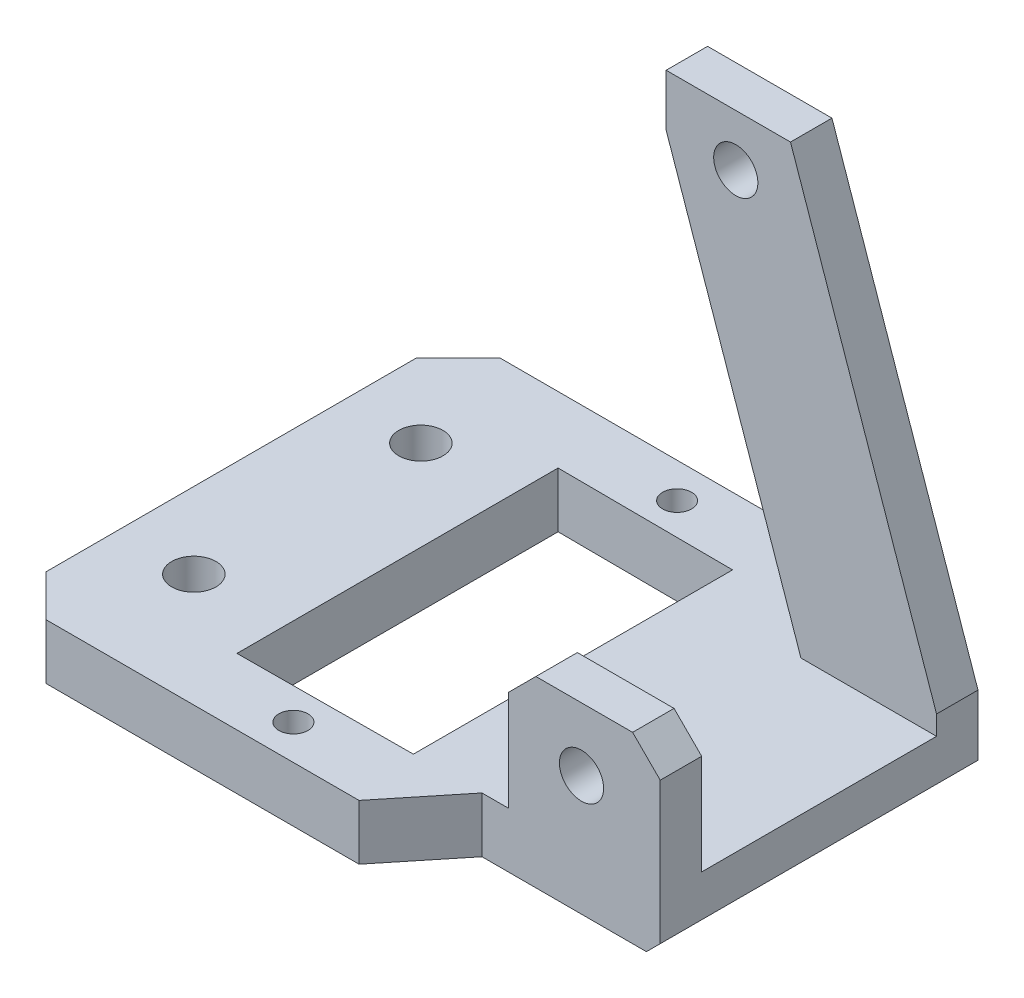
ISO-10303-21;
HEADER;
FILE_DESCRIPTION(('STEP AP214'),'2;1');
FILE_NAME('part.step','',(''),(''),'','','');
FILE_SCHEMA(('AUTOMOTIVE_DESIGN { 1 0 10303 214 1 1 1 1 }'));
ENDSEC;
DATA;
#1=APPLICATION_CONTEXT('core data for automotive mechanical design processes');
#2=APPLICATION_PROTOCOL_DEFINITION('international standard','automotive_design',2000,#1);
#3=PRODUCT_CONTEXT('',#1,'mechanical');
#4=PRODUCT('Part','Part','',(#3));
#5=PRODUCT_RELATED_PRODUCT_CATEGORY('part','',(#4));
#6=PRODUCT_DEFINITION_FORMATION('','',#4);
#7=PRODUCT_DEFINITION_CONTEXT('part definition',#1,'design');
#8=PRODUCT_DEFINITION('design','',#6,#7);
#9=PRODUCT_DEFINITION_SHAPE('','',#8);
#10=(LENGTH_UNIT() NAMED_UNIT(*) SI_UNIT(.MILLI.,.METRE.));
#11=(NAMED_UNIT(*) PLANE_ANGLE_UNIT() SI_UNIT($,.RADIAN.));
#12=(NAMED_UNIT(*) SI_UNIT($,.STERADIAN.) SOLID_ANGLE_UNIT());
#13=UNCERTAINTY_MEASURE_WITH_UNIT(LENGTH_MEASURE(1.E-05),#10,'distance_accuracy_value','');
#14=(GEOMETRIC_REPRESENTATION_CONTEXT(3) GLOBAL_UNCERTAINTY_ASSIGNED_CONTEXT((#13)) GLOBAL_UNIT_ASSIGNED_CONTEXT((#10,
#11,#12)) REPRESENTATION_CONTEXT('',''));
#15=CARTESIAN_POINT('',(0.,0.,0.));
#16=DIRECTION('',(0.,0.,1.));
#17=DIRECTION('',(1.,0.,0.));
#18=AXIS2_PLACEMENT_3D('',#15,#16,#17);
#19=CARTESIAN_POINT('',(17.5,4.,0.));
#20=DIRECTION('',(-1.,0.,0.));
#21=DIRECTION('',(0.,0.,1.));
#22=AXIS2_PLACEMENT_3D('',#19,#20,#21);
#23=PLANE('',#22);
#24=DIRECTION('',(0.,1.,0.));
#25=VECTOR('',#24,1.);
#26=CARTESIAN_POINT('',(17.5,2.25079433715874,8.5));
#27=LINE('',#26,#25);
#28=CARTESIAN_POINT('',(17.5,4.,8.5));
#29=VERTEX_POINT('',#28);
#30=CARTESIAN_POINT('',(17.5,11.2507943371587,8.5));
#31=VERTEX_POINT('',#30);
#32=EDGE_CURVE('E338',#29,#31,#27,.T.);
#33=ORIENTED_EDGE('',*,*,#32,.T.);
#34=DIRECTION('',(0.,0.,1.));
#35=VECTOR('',#34,1.);
#36=CARTESIAN_POINT('',(17.5,11.2507943371587,11.5));
#37=LINE('',#36,#35);
#38=CARTESIAN_POINT('',(17.5,11.2507943371587,11.5));
#39=VERTEX_POINT('',#38);
#40=EDGE_CURVE('E407',#31,#39,#37,.T.);
#41=ORIENTED_EDGE('',*,*,#40,.T.);
#42=DIRECTION('',(0.,-1.,0.));
#43=VECTOR('',#42,1.);
#44=CARTESIAN_POINT('',(17.5,4.,11.5));
#45=LINE('',#44,#43);
#46=CARTESIAN_POINT('',(17.5,0.999999999999994,11.5));
#47=VERTEX_POINT('',#46);
#48=EDGE_CURVE('E359',#39,#47,#45,.T.);
#49=ORIENTED_EDGE('',*,*,#48,.T.);
#50=DIRECTION('',(0.,0.,-1.));
#51=VECTOR('',#50,1.);
#52=CARTESIAN_POINT('',(17.5,0.999999999999994,0.));
#53=LINE('',#52,#51);
#54=CARTESIAN_POINT('',(17.5,0.999999999999994,-11.5));
#55=VERTEX_POINT('',#54);
#56=EDGE_CURVE('E375',#47,#55,#53,.T.);
#57=ORIENTED_EDGE('',*,*,#56,.T.);
#58=DIRECTION('',(0.,-1.,0.));
#59=VECTOR('',#58,1.);
#60=CARTESIAN_POINT('',(17.5,4.,-11.5));
#61=LINE('',#60,#59);
#62=CARTESIAN_POINT('',(17.5,5.39908922103168,-11.5));
#63=VERTEX_POINT('',#62);
#64=EDGE_CURVE('E364',#63,#55,#61,.T.);
#65=ORIENTED_EDGE('',*,*,#64,.F.);
#66=DIRECTION('',(0.,0.,-1.));
#67=VECTOR('',#66,1.);
#68=CARTESIAN_POINT('',(17.5,5.39908922103168,-8.5));
#69=LINE('',#68,#67);
#70=CARTESIAN_POINT('',(17.5,5.39908922103168,-8.5));
#71=VERTEX_POINT('',#70);
#72=EDGE_CURVE('E326',#71,#63,#69,.T.);
#73=ORIENTED_EDGE('',*,*,#72,.F.);
#74=DIRECTION('',(0.,-1.,0.));
#75=VECTOR('',#74,1.);
#76=CARTESIAN_POINT('',(17.5,2.4942576008242,-8.5));
#77=LINE('',#76,#75);
#78=CARTESIAN_POINT('',(17.5,4.,-8.5));
#79=VERTEX_POINT('',#78);
#80=EDGE_CURVE('E311',#71,#79,#77,.T.);
#81=ORIENTED_EDGE('',*,*,#80,.T.);
#82=DIRECTION('',(0.,0.,-1.));
#83=VECTOR('',#82,1.);
#84=CARTESIAN_POINT('',(17.5,4.,0.));
#85=LINE('',#84,#83);
#86=EDGE_CURVE('E350',#29,#79,#85,.T.);
#87=ORIENTED_EDGE('',*,*,#86,.F.);
#88=EDGE_LOOP('',(#33,#41,#49,#57,#65,#73,#81,#87));
#89=FACE_BOUND('',#88,.T.);
#90=ADVANCED_FACE('F36',(#89),#23,.F.);
#91=CARTESIAN_POINT('',(-17.5,4.,-11.5));
#92=DIRECTION('',(0.,0.,1.));
#93=DIRECTION('',(1.,0.,0.));
#94=AXIS2_PLACEMENT_3D('',#91,#92,#93);
#95=PLANE('',#94);
#96=CARTESIAN_POINT('',(2.96715212901444,32.2271214046752,-11.5));
#97=DIRECTION('',(0.,0.,-1.));
#98=DIRECTION('',(-1.,0.,0.));
#99=AXIS2_PLACEMENT_3D('',#96,#97,#98);
#100=CIRCLE('',#99,1.6);
#101=CARTESIAN_POINT('',(1.36715212901444,32.2271214046752,-11.5));
#102=VERTEX_POINT('',#101);
#103=EDGE_CURVE('E283',#102,#102,#100,.T.);
#104=ORIENTED_EDGE('',*,*,#103,.F.);
#105=EDGE_LOOP('',(#104));
#106=FACE_BOUND('',#105,.T.);
#107=ORIENTED_EDGE('',*,*,#64,.T.);
#108=DIRECTION('',(0.70710678118655,0.707106781186545,0.));
#109=VECTOR('',#108,1.);
#110=CARTESIAN_POINT('',(17.5,0.999999999999994,-11.5));
#111=LINE('',#110,#109);
#112=CARTESIAN_POINT('',(16.5,0.,-11.5));
#113=VERTEX_POINT('',#112);
#114=EDGE_CURVE('E382',#55,#113,#111,.F.);
#115=ORIENTED_EDGE('',*,*,#114,.T.);
#116=DIRECTION('',(-1.,0.,0.));
#117=VECTOR('',#116,1.);
#118=CARTESIAN_POINT('',(-17.5,0.,-11.5));
#119=LINE('',#118,#117);
#120=CARTESIAN_POINT('',(4.5983698282398,0.,-11.5));
#121=VERTEX_POINT('',#120);
#122=EDGE_CURVE('E346',#113,#121,#119,.T.);
#123=ORIENTED_EDGE('',*,*,#122,.T.);
#124=DIRECTION('',(0.,-1.,0.));
#125=VECTOR('',#124,1.);
#126=CARTESIAN_POINT('',(4.5983698282398,4.,-11.5));
#127=LINE('',#126,#125);
#128=CARTESIAN_POINT('',(4.5983698282398,4.,-11.5));
#129=VERTEX_POINT('',#128);
#130=EDGE_CURVE('E280',#129,#121,#127,.T.);
#131=ORIENTED_EDGE('',*,*,#130,.F.);
#132=DIRECTION('',(-1.,0.,0.));
#133=VECTOR('',#132,1.);
#134=CARTESIAN_POINT('',(-17.5,4.,-11.5));
#135=LINE('',#134,#133);
#136=CARTESIAN_POINT('',(7.68437660414634,4.,-11.5));
#137=VERTEX_POINT('',#136);
#138=EDGE_CURVE('E352',#137,#129,#135,.T.);
#139=ORIENTED_EDGE('',*,*,#138,.F.);
#140=DIRECTION('',(-0.326857240584192,0.945073724255249,0.));
#141=VECTOR('',#140,1.);
#142=CARTESIAN_POINT('',(-2.07230392184058,32.2104272329498,-11.5));
#143=LINE('',#142,#141);
#144=CARTESIAN_POINT('',(-2.07230392184058,32.2104272329498,-11.5));
#145=VERTEX_POINT('',#144);
#146=EDGE_CURVE('E315',#137,#145,#143,.T.);
#147=ORIENTED_EDGE('',*,*,#146,.T.);
#148=DIRECTION('',(0.,1.,0.));
#149=VECTOR('',#148,1.);
#150=CARTESIAN_POINT('',(-2.07230392184058,35.9660803578377,-11.5));
#151=LINE('',#150,#149);
#152=CARTESIAN_POINT('',(-2.07230392184058,35.9660803578377,-11.5));
#153=VERTEX_POINT('',#152);
#154=EDGE_CURVE('E318',#145,#153,#151,.T.);
#155=ORIENTED_EDGE('',*,*,#154,.T.);
#156=DIRECTION('',(1.,0.,0.));
#157=VECTOR('',#156,1.);
#158=CARTESIAN_POINT('',(6.92829313785952,35.9660803578377,-11.5));
#159=LINE('',#158,#157);
#160=CARTESIAN_POINT('',(6.92829313785952,35.9660803578377,-11.5));
#161=VERTEX_POINT('',#160);
#162=EDGE_CURVE('E321',#153,#161,#159,.T.);
#163=ORIENTED_EDGE('',*,*,#162,.T.);
#164=DIRECTION('',(0.326857240584192,-0.94507372425525,0.));
#165=VECTOR('',#164,1.);
#166=CARTESIAN_POINT('',(17.5,5.39908922103168,-11.5));
#167=LINE('',#166,#165);
#168=EDGE_CURVE('E302',#161,#63,#167,.T.);
#169=ORIENTED_EDGE('',*,*,#168,.T.);
#170=EDGE_LOOP('',(#107,#115,#123,#131,#139,#147,#155,#163,#169));
#171=FACE_BOUND('',#170,.T.);
#172=ADVANCED_FACE('F456',(#106,#171),#95,.F.);
#173=CARTESIAN_POINT('',(-17.5,4.,11.5));
#174=DIRECTION('',(0.,0.,-1.));
#175=DIRECTION('',(-1.,0.,0.));
#176=AXIS2_PLACEMENT_3D('',#173,#174,#175);
#177=PLANE('',#176);
#178=CARTESIAN_POINT('',(11.8027037107566,8.68330085829427,11.5));
#179=DIRECTION('',(0.,0.,1.));
#180=DIRECTION('',(1.,0.,0.));
#181=AXIS2_PLACEMENT_3D('',#178,#179,#180);
#182=CIRCLE('',#181,1.6);
#183=CARTESIAN_POINT('',(13.4027037107566,8.68330085829427,11.5));
#184=VERTEX_POINT('',#183);
#185=EDGE_CURVE('E294',#184,#184,#182,.T.);
#186=ORIENTED_EDGE('',*,*,#185,.F.);
#187=EDGE_LOOP('',(#186));
#188=FACE_BOUND('',#187,.T.);
#189=ORIENTED_EDGE('',*,*,#48,.F.);
#190=DIRECTION('',(-0.70710678118655,0.707106781186545,0.));
#191=VECTOR('',#190,1.);
#192=CARTESIAN_POINT('',(17.5,11.2507943371587,11.5));
#193=LINE('',#192,#191);
#194=CARTESIAN_POINT('',(15.5,13.2507943371587,11.5));
#195=VERTEX_POINT('',#194);
#196=EDGE_CURVE('E412',#39,#195,#193,.T.);
#197=ORIENTED_EDGE('',*,*,#196,.T.);
#198=DIRECTION('',(-1.,0.,0.));
#199=VECTOR('',#198,1.);
#200=CARTESIAN_POINT('',(17.5,13.2507943371587,11.5));
#201=LINE('',#200,#199);
#202=CARTESIAN_POINT('',(8.49999999999999,13.2507943371587,11.5));
#203=VERTEX_POINT('',#202);
#204=EDGE_CURVE('E329',#195,#203,#201,.T.);
#205=ORIENTED_EDGE('',*,*,#204,.T.);
#206=DIRECTION('',(0.707106781186545,0.70710678118655,0.));
#207=VECTOR('',#206,1.);
#208=CARTESIAN_POINT('',(8.49999999999999,13.2507943371587,11.5));
#209=LINE('',#208,#207);
#210=CARTESIAN_POINT('',(6.5,11.2507943371587,11.5));
#211=VERTEX_POINT('',#210);
#212=EDGE_CURVE('E410',#203,#211,#209,.F.);
#213=ORIENTED_EDGE('',*,*,#212,.T.);
#214=DIRECTION('',(0.,-1.,0.));
#215=VECTOR('',#214,1.);
#216=CARTESIAN_POINT('',(6.5,13.2507943371587,11.5));
#217=LINE('',#216,#215);
#218=CARTESIAN_POINT('',(6.5,4.,11.5));
#219=VERTEX_POINT('',#218);
#220=EDGE_CURVE('E342',#211,#219,#217,.T.);
#221=ORIENTED_EDGE('',*,*,#220,.T.);
#222=DIRECTION('',(1.,0.,0.));
#223=VECTOR('',#222,1.);
#224=CARTESIAN_POINT('',(-17.5,4.,11.5));
#225=LINE('',#224,#223);
#226=CARTESIAN_POINT('',(4.5983698282398,4.,11.5));
#227=VERTEX_POINT('',#226);
#228=EDGE_CURVE('E356',#227,#219,#225,.T.);
#229=ORIENTED_EDGE('',*,*,#228,.F.);
#230=DIRECTION('',(0.,-1.,0.));
#231=VECTOR('',#230,1.);
#232=CARTESIAN_POINT('',(4.5983698282398,4.,11.5));
#233=LINE('',#232,#231);
#234=CARTESIAN_POINT('',(4.5983698282398,0.,11.5));
#235=VERTEX_POINT('',#234);
#236=EDGE_CURVE('E267',#227,#235,#233,.T.);
#237=ORIENTED_EDGE('',*,*,#236,.T.);
#238=DIRECTION('',(1.,0.,0.));
#239=VECTOR('',#238,1.);
#240=CARTESIAN_POINT('',(-17.5,0.,11.5));
#241=LINE('',#240,#239);
#242=CARTESIAN_POINT('',(16.5,0.,11.5));
#243=VERTEX_POINT('',#242);
#244=EDGE_CURVE('E353',#235,#243,#241,.T.);
#245=ORIENTED_EDGE('',*,*,#244,.T.);
#246=DIRECTION('',(-0.70710678118655,-0.707106781186545,0.));
#247=VECTOR('',#246,1.);
#248=CARTESIAN_POINT('',(17.5,0.999999999999994,11.5));
#249=LINE('',#248,#247);
#250=EDGE_CURVE('E386',#243,#47,#249,.F.);
#251=ORIENTED_EDGE('',*,*,#250,.T.);
#252=EDGE_LOOP('',(#189,#197,#205,#213,#221,#229,#237,#245,#251));
#253=FACE_BOUND('',#252,.T.);
#254=ADVANCED_FACE('F432',(#188,#253),#177,.F.);
#255=CARTESIAN_POINT('',(0.,4.,0.));
#256=DIRECTION('',(0.,1.,0.));
#257=DIRECTION('',(0.,0.,1.));
#258=AXIS2_PLACEMENT_3D('',#255,#256,#257);
#259=PLANE('',#258);
#260=CARTESIAN_POINT('',(-19.5416286387112,4.,-8.21675567249479));
#261=DIRECTION('',(0.,1.,0.));
#262=DIRECTION('',(0.,0.,1.));
#263=AXIS2_PLACEMENT_3D('',#260,#261,#262);
#264=CIRCLE('',#263,1.6);
#265=CARTESIAN_POINT('',(-19.5416286387112,4.,-6.61675567249479));
#266=VERTEX_POINT('',#265);
#267=EDGE_CURVE('E235',#266,#266,#264,.T.);
#268=ORIENTED_EDGE('',*,*,#267,.F.);
#269=EDGE_LOOP('',(#268));
#270=FACE_BOUND('',#269,.T.);
#271=CARTESIAN_POINT('',(-19.5416286387112,4.,8.21675567249479));
#272=DIRECTION('',(0.,1.,0.));
#273=DIRECTION('',(0.,0.,1.));
#274=AXIS2_PLACEMENT_3D('',#271,#272,#273);
#275=CIRCLE('',#274,1.6);
#276=CARTESIAN_POINT('',(-19.5416286387112,4.,9.81675567249479));
#277=VERTEX_POINT('',#276);
#278=EDGE_CURVE('E830',#277,#277,#275,.T.);
#279=ORIENTED_EDGE('',*,*,#278,.F.);
#280=EDGE_LOOP('',(#279));
#281=FACE_BOUND('',#280,.T.);
#282=CARTESIAN_POINT('',(-6.66562339585366,4.,-13.8865062304826));
#283=DIRECTION('',(0.,1.,0.));
#284=DIRECTION('',(0.,0.,1.));
#285=AXIS2_PLACEMENT_3D('',#282,#283,#284);
#286=CIRCLE('',#285,1.04999999999999);
#287=CARTESIAN_POINT('',(-6.66562339585366,4.,-12.8365062304826));
#288=VERTEX_POINT('',#287);
#289=EDGE_CURVE('E822',#288,#288,#286,.T.);
#290=ORIENTED_EDGE('',*,*,#289,.F.);
#291=EDGE_LOOP('',(#290));
#292=FACE_BOUND('',#291,.T.);
#293=CARTESIAN_POINT('',(-6.66562339585366,4.,13.8865062304826));
#294=DIRECTION('',(0.,1.,0.));
#295=DIRECTION('',(0.,0.,1.));
#296=AXIS2_PLACEMENT_3D('',#293,#294,#295);
#297=CIRCLE('',#296,1.05);
#298=CARTESIAN_POINT('',(-6.66562339585366,4.,14.9365062304826));
#299=VERTEX_POINT('',#298);
#300=EDGE_CURVE('E816',#299,#299,#297,.T.);
#301=ORIENTED_EDGE('',*,*,#300,.F.);
#302=EDGE_LOOP('',(#301));
#303=FACE_BOUND('',#302,.T.);
#304=DIRECTION('',(-0.999983509156498,0.,-0.00574294480693368));
#305=VECTOR('',#304,1.);
#306=CARTESIAN_POINT('',(-13.0156233958537,4.,-11.6229366018341));
#307=LINE('',#306,#305);
#308=CARTESIAN_POINT('',(-0.31562339585366,4.,-11.55));
#309=VERTEX_POINT('',#308);
#310=CARTESIAN_POINT('',(-13.0156233958537,4.,-11.6229366018341));
#311=VERTEX_POINT('',#310);
#312=EDGE_CURVE('E211',#309,#311,#307,.T.);
#313=ORIENTED_EDGE('',*,*,#312,.F.);
#314=DIRECTION('',(0.,0.,-1.));
#315=VECTOR('',#314,1.);
#316=CARTESIAN_POINT('',(-0.31562339585366,4.,-11.55));
#317=LINE('',#316,#315);
#318=CARTESIAN_POINT('',(-0.31562339585366,4.,11.55));
#319=VERTEX_POINT('',#318);
#320=EDGE_CURVE('E229',#319,#309,#317,.T.);
#321=ORIENTED_EDGE('',*,*,#320,.F.);
#322=DIRECTION('',(0.999983509156498,0.,-0.00574294480693368));
#323=VECTOR('',#322,1.);
#324=CARTESIAN_POINT('',(-13.0156233958537,4.,11.6229366018341));
#325=LINE('',#324,#323);
#326=CARTESIAN_POINT('',(-13.0156233958537,4.,11.6229366018341));
#327=VERTEX_POINT('',#326);
#328=EDGE_CURVE('E232',#327,#319,#325,.T.);
#329=ORIENTED_EDGE('',*,*,#328,.F.);
#330=DIRECTION('',(0.,0.,1.));
#331=VECTOR('',#330,1.);
#332=CARTESIAN_POINT('',(-13.0156233958537,4.,11.6229366018341));
#333=LINE('',#332,#331);
#334=EDGE_CURVE('E241',#311,#327,#333,.T.);
#335=ORIENTED_EDGE('',*,*,#334,.F.);
#336=EDGE_LOOP('',(#313,#321,#329,#335));
#337=FACE_BOUND('',#336,.T.);
#338=DIRECTION('',(1.,0.,0.));
#339=VECTOR('',#338,1.);
#340=CARTESIAN_POINT('',(0.617432869683107,4.,-16.4167556724948));
#341=LINE('',#340,#339);
#342=CARTESIAN_POINT('',(-22.0416286387112,4.,-16.4167556724948));
#343=VERTEX_POINT('',#342);
#344=CARTESIAN_POINT('',(0.617432869683107,4.,-16.4167556724948));
#345=VERTEX_POINT('',#344);
#346=EDGE_CURVE('E262',#343,#345,#341,.T.);
#347=ORIENTED_EDGE('',*,*,#346,.F.);
#348=DIRECTION('',(0.707106781186549,0.,-0.707106781186546));
#349=VECTOR('',#348,1.);
#350=CARTESIAN_POINT('',(-19.229192155603,4.,-19.229192155603));
#351=LINE('',#350,#349);
#352=CARTESIAN_POINT('',(-25.0416286387112,4.,-13.4167556724948));
#353=VERTEX_POINT('',#352);
#354=EDGE_CURVE('E402',#343,#353,#351,.F.);
#355=ORIENTED_EDGE('',*,*,#354,.T.);
#356=DIRECTION('',(0.,0.,-1.));
#357=VECTOR('',#356,1.);
#358=CARTESIAN_POINT('',(-25.0416286387112,4.,-16.4167556724948));
#359=LINE('',#358,#357);
#360=CARTESIAN_POINT('',(-25.0416286387112,4.,13.4167556724948));
#361=VERTEX_POINT('',#360);
#362=EDGE_CURVE('E259',#361,#353,#359,.T.);
#363=ORIENTED_EDGE('',*,*,#362,.F.);
#364=DIRECTION('',(-0.707106781186546,0.,-0.707106781186549));
#365=VECTOR('',#364,1.);
#366=CARTESIAN_POINT('',(-19.2291921556031,4.,19.229192155603));
#367=LINE('',#366,#365);
#368=CARTESIAN_POINT('',(-22.0416286387112,4.,16.4167556724948));
#369=VERTEX_POINT('',#368);
#370=EDGE_CURVE('E400',#361,#369,#367,.F.);
#371=ORIENTED_EDGE('',*,*,#370,.T.);
#372=DIRECTION('',(-1.,0.,0.));
#373=VECTOR('',#372,1.);
#374=CARTESIAN_POINT('',(0.617432869683107,4.,16.4167556724948));
#375=LINE('',#374,#373);
#376=CARTESIAN_POINT('',(0.617432869683107,4.,16.4167556724948));
#377=VERTEX_POINT('',#376);
#378=EDGE_CURVE('E255',#377,#369,#375,.T.);
#379=ORIENTED_EDGE('',*,*,#378,.F.);
#380=DIRECTION('',(-0.629265660071774,0.,0.777190278538296));
#381=VECTOR('',#380,1.);
#382=CARTESIAN_POINT('',(4.5983698282398,4.,11.5));
#383=LINE('',#382,#381);
#384=EDGE_CURVE('E252',#227,#377,#383,.T.);
#385=ORIENTED_EDGE('',*,*,#384,.F.);
#386=ORIENTED_EDGE('',*,*,#228,.T.);
#387=DIRECTION('',(0.,0.,1.));
#388=VECTOR('',#387,1.);
#389=CARTESIAN_POINT('',(6.5,4.,0.));
#390=LINE('',#389,#388);
#391=CARTESIAN_POINT('',(6.5,4.,8.5));
#392=VERTEX_POINT('',#391);
#393=EDGE_CURVE('E369',#392,#219,#390,.T.);
#394=ORIENTED_EDGE('',*,*,#393,.F.);
#395=DIRECTION('',(1.,0.,0.));
#396=VECTOR('',#395,1.);
#397=CARTESIAN_POINT('',(0.,4.,8.5));
#398=LINE('',#397,#396);
#399=EDGE_CURVE('E367',#392,#29,#398,.T.);
#400=ORIENTED_EDGE('',*,*,#399,.T.);
#401=ORIENTED_EDGE('',*,*,#86,.T.);
#402=DIRECTION('',(1.,0.,0.));
#403=VECTOR('',#402,1.);
#404=CARTESIAN_POINT('',(0.,4.,-8.5));
#405=LINE('',#404,#403);
#406=CARTESIAN_POINT('',(7.68437660414634,4.,-8.5));
#407=VERTEX_POINT('',#406);
#408=EDGE_CURVE('E372',#407,#79,#405,.T.);
#409=ORIENTED_EDGE('',*,*,#408,.F.);
#410=DIRECTION('',(0.,0.,-1.));
#411=VECTOR('',#410,1.);
#412=CARTESIAN_POINT('',(7.68437660414634,4.,-8.5));
#413=LINE('',#412,#411);
#414=EDGE_CURVE('E314',#407,#137,#413,.T.);
#415=ORIENTED_EDGE('',*,*,#414,.T.);
#416=ORIENTED_EDGE('',*,*,#138,.T.);
#417=DIRECTION('',(0.629265660071774,0.,0.777190278538296));
#418=VECTOR('',#417,1.);
#419=CARTESIAN_POINT('',(4.5983698282398,4.,-11.5));
#420=LINE('',#419,#418);
#421=EDGE_CURVE('E264',#345,#129,#420,.T.);
#422=ORIENTED_EDGE('',*,*,#421,.F.);
#423=EDGE_LOOP('',(#347,#355,#363,#371,#379,#385,#386,#394,#400,#401,#409,#415,#416,#422));
#424=FACE_BOUND('',#423,.T.);
#425=ADVANCED_FACE('F441',(#270,#281,#292,#303,#337,#424),#259,.T.);
#426=CARTESIAN_POINT('',(0.,0.,0.));
#427=DIRECTION('',(0.,1.,0.));
#428=DIRECTION('',(0.,0.,1.));
#429=AXIS2_PLACEMENT_3D('',#426,#427,#428);
#430=PLANE('',#429);
#431=CARTESIAN_POINT('',(-19.5416286387112,0.,-8.21675567249479));
#432=DIRECTION('',(0.,1.,0.));
#433=DIRECTION('',(0.,0.,1.));
#434=AXIS2_PLACEMENT_3D('',#431,#432,#433);
#435=CIRCLE('',#434,1.6);
#436=CARTESIAN_POINT('',(-19.5416286387112,0.,-6.61675567249479));
#437=VERTEX_POINT('',#436);
#438=EDGE_CURVE('E832',#437,#437,#435,.T.);
#439=ORIENTED_EDGE('',*,*,#438,.T.);
#440=EDGE_LOOP('',(#439));
#441=FACE_BOUND('',#440,.T.);
#442=CARTESIAN_POINT('',(-19.5416286387112,0.,8.21675567249479));
#443=DIRECTION('',(0.,1.,0.));
#444=DIRECTION('',(0.,0.,1.));
#445=AXIS2_PLACEMENT_3D('',#442,#443,#444);
#446=CIRCLE('',#445,1.6);
#447=CARTESIAN_POINT('',(-19.5416286387112,0.,9.81675567249479));
#448=VERTEX_POINT('',#447);
#449=EDGE_CURVE('E827',#448,#448,#446,.T.);
#450=ORIENTED_EDGE('',*,*,#449,.T.);
#451=EDGE_LOOP('',(#450));
#452=FACE_BOUND('',#451,.T.);
#453=CARTESIAN_POINT('',(-6.66562339585366,0.,-13.8865062304826));
#454=DIRECTION('',(0.,1.,0.));
#455=DIRECTION('',(0.,0.,1.));
#456=AXIS2_PLACEMENT_3D('',#453,#454,#455);
#457=CIRCLE('',#456,1.04999999999999);
#458=CARTESIAN_POINT('',(-6.66562339585366,0.,-12.8365062304826));
#459=VERTEX_POINT('',#458);
#460=EDGE_CURVE('E818',#459,#459,#457,.T.);
#461=ORIENTED_EDGE('',*,*,#460,.T.);
#462=EDGE_LOOP('',(#461));
#463=FACE_BOUND('',#462,.T.);
#464=CARTESIAN_POINT('',(-6.66562339585366,0.,13.8865062304826));
#465=DIRECTION('',(0.,1.,0.));
#466=DIRECTION('',(0.,0.,1.));
#467=AXIS2_PLACEMENT_3D('',#464,#465,#466);
#468=CIRCLE('',#467,1.05);
#469=CARTESIAN_POINT('',(-6.66562339585366,0.,14.9365062304826));
#470=VERTEX_POINT('',#469);
#471=EDGE_CURVE('E242',#470,#470,#468,.T.);
#472=ORIENTED_EDGE('',*,*,#471,.T.);
#473=EDGE_LOOP('',(#472));
#474=FACE_BOUND('',#473,.T.);
#475=DIRECTION('',(0.,0.,-1.));
#476=VECTOR('',#475,1.);
#477=CARTESIAN_POINT('',(-0.31562339585366,0.,-11.55));
#478=LINE('',#477,#476);
#479=CARTESIAN_POINT('',(-0.31562339585366,0.,11.55));
#480=VERTEX_POINT('',#479);
#481=CARTESIAN_POINT('',(-0.31562339585366,0.,-11.55));
#482=VERTEX_POINT('',#481);
#483=EDGE_CURVE('E216',#480,#482,#478,.T.);
#484=ORIENTED_EDGE('',*,*,#483,.T.);
#485=DIRECTION('',(-0.999983509156498,0.,-0.00574294480693368));
#486=VECTOR('',#485,1.);
#487=CARTESIAN_POINT('',(-13.0156233958537,0.,-11.6229366018341));
#488=LINE('',#487,#486);
#489=CARTESIAN_POINT('',(-13.0156233958537,0.,-11.6229366018341));
#490=VERTEX_POINT('',#489);
#491=EDGE_CURVE('E208',#482,#490,#488,.T.);
#492=ORIENTED_EDGE('',*,*,#491,.T.);
#493=DIRECTION('',(0.,0.,1.));
#494=VECTOR('',#493,1.);
#495=CARTESIAN_POINT('',(-13.0156233958537,0.,11.6229366018341));
#496=LINE('',#495,#494);
#497=CARTESIAN_POINT('',(-13.0156233958537,0.,11.6229366018341));
#498=VERTEX_POINT('',#497);
#499=EDGE_CURVE('E220',#490,#498,#496,.T.);
#500=ORIENTED_EDGE('',*,*,#499,.T.);
#501=DIRECTION('',(0.999983509156498,0.,-0.00574294480693368));
#502=VECTOR('',#501,1.);
#503=CARTESIAN_POINT('',(-13.0156233958537,0.,11.6229366018341));
#504=LINE('',#503,#502);
#505=EDGE_CURVE('E224',#498,#480,#504,.T.);
#506=ORIENTED_EDGE('',*,*,#505,.T.);
#507=EDGE_LOOP('',(#484,#492,#500,#506));
#508=FACE_BOUND('',#507,.T.);
#509=DIRECTION('',(0.,0.,-1.));
#510=VECTOR('',#509,1.);
#511=CARTESIAN_POINT('',(-25.0416286387112,0.,-16.4167556724948));
#512=LINE('',#511,#510);
#513=CARTESIAN_POINT('',(-25.0416286387112,0.,13.4167556724948));
#514=VERTEX_POINT('',#513);
#515=CARTESIAN_POINT('',(-25.0416286387112,0.,-13.4167556724948));
#516=VERTEX_POINT('',#515);
#517=EDGE_CURVE('E273',#514,#516,#512,.T.);
#518=ORIENTED_EDGE('',*,*,#517,.T.);
#519=DIRECTION('',(-0.707106781186549,0.,0.707106781186546));
#520=VECTOR('',#519,1.);
#521=CARTESIAN_POINT('',(-25.0416286387112,0.,-13.4167556724948));
#522=LINE('',#521,#520);
#523=CARTESIAN_POINT('',(-22.0416286387112,0.,-16.4167556724948));
#524=VERTEX_POINT('',#523);
#525=EDGE_CURVE('E396',#516,#524,#522,.F.);
#526=ORIENTED_EDGE('',*,*,#525,.T.);
#527=DIRECTION('',(1.,0.,0.));
#528=VECTOR('',#527,1.);
#529=CARTESIAN_POINT('',(0.617432869683107,0.,-16.4167556724948));
#530=LINE('',#529,#528);
#531=CARTESIAN_POINT('',(0.617432869683107,0.,-16.4167556724948));
#532=VERTEX_POINT('',#531);
#533=EDGE_CURVE('E276',#524,#532,#530,.T.);
#534=ORIENTED_EDGE('',*,*,#533,.T.);
#535=DIRECTION('',(0.629265660071774,0.,0.777190278538296));
#536=VECTOR('',#535,1.);
#537=CARTESIAN_POINT('',(4.5983698282398,0.,-11.5));
#538=LINE('',#537,#536);
#539=EDGE_CURVE('E256',#532,#121,#538,.T.);
#540=ORIENTED_EDGE('',*,*,#539,.T.);
#541=ORIENTED_EDGE('',*,*,#122,.F.);
#542=DIRECTION('',(0.,0.,1.));
#543=VECTOR('',#542,1.);
#544=CARTESIAN_POINT('',(16.5,0.,0.));
#545=LINE('',#544,#543);
#546=EDGE_CURVE('E384',#113,#243,#545,.T.);
#547=ORIENTED_EDGE('',*,*,#546,.T.);
#548=ORIENTED_EDGE('',*,*,#244,.F.);
#549=DIRECTION('',(-0.629265660071774,0.,0.777190278538296));
#550=VECTOR('',#549,1.);
#551=CARTESIAN_POINT('',(4.5983698282398,0.,11.5));
#552=LINE('',#551,#550);
#553=CARTESIAN_POINT('',(0.617432869683107,0.,16.4167556724948));
#554=VERTEX_POINT('',#553);
#555=EDGE_CURVE('E248',#235,#554,#552,.T.);
#556=ORIENTED_EDGE('',*,*,#555,.T.);
#557=DIRECTION('',(-1.,0.,0.));
#558=VECTOR('',#557,1.);
#559=CARTESIAN_POINT('',(0.617432869683107,0.,16.4167556724948));
#560=LINE('',#559,#558);
#561=CARTESIAN_POINT('',(-22.0416286387112,0.,16.4167556724948));
#562=VERTEX_POINT('',#561);
#563=EDGE_CURVE('E270',#554,#562,#560,.T.);
#564=ORIENTED_EDGE('',*,*,#563,.T.);
#565=DIRECTION('',(0.707106781186546,0.,0.707106781186549));
#566=VECTOR('',#565,1.);
#567=CARTESIAN_POINT('',(-22.0416286387112,0.,16.4167556724948));
#568=LINE('',#567,#566);
#569=EDGE_CURVE('E394',#562,#514,#568,.F.);
#570=ORIENTED_EDGE('',*,*,#569,.T.);
#571=EDGE_LOOP('',(#518,#526,#534,#540,#541,#547,#548,#556,#564,#570));
#572=FACE_BOUND('',#571,.T.);
#573=ADVANCED_FACE('F226',(#441,#452,#463,#474,#508,#572),#430,.F.);
#574=CARTESIAN_POINT('',(6.5,13.2507943371587,8.5));
#575=DIRECTION('',(-1.,0.,0.));
#576=DIRECTION('',(0.,-1.,0.));
#577=AXIS2_PLACEMENT_3D('',#574,#575,#576);
#578=PLANE('',#577);
#579=ORIENTED_EDGE('',*,*,#220,.F.);
#580=DIRECTION('',(0.,0.,-1.));
#581=VECTOR('',#580,1.);
#582=CARTESIAN_POINT('',(6.5,11.2507943371587,8.5));
#583=LINE('',#582,#581);
#584=CARTESIAN_POINT('',(6.5,11.2507943371587,8.5));
#585=VERTEX_POINT('',#584);
#586=EDGE_CURVE('E11',#211,#585,#583,.T.);
#587=ORIENTED_EDGE('',*,*,#586,.T.);
#588=DIRECTION('',(0.,-1.,0.));
#589=VECTOR('',#588,1.);
#590=CARTESIAN_POINT('',(6.5,13.2507943371587,8.5));
#591=LINE('',#590,#589);
#592=EDGE_CURVE('E344',#585,#392,#591,.T.);
#593=ORIENTED_EDGE('',*,*,#592,.T.);
#594=ORIENTED_EDGE('',*,*,#393,.T.);
#595=EDGE_LOOP('',(#579,#587,#593,#594));
#596=FACE_BOUND('',#595,.T.);
#597=ADVANCED_FACE('F437',(#596),#578,.T.);
#598=CARTESIAN_POINT('',(17.5,13.2507943371587,8.5));
#599=DIRECTION('',(0.,1.,0.));
#600=DIRECTION('',(0.,0.,1.));
#601=AXIS2_PLACEMENT_3D('',#598,#599,#600);
#602=PLANE('',#601);
#603=ORIENTED_EDGE('',*,*,#204,.F.);
#604=DIRECTION('',(0.,0.,-1.));
#605=VECTOR('',#604,1.);
#606=CARTESIAN_POINT('',(15.5,13.2507943371587,8.5));
#607=LINE('',#606,#605);
#608=CARTESIAN_POINT('',(15.5,13.2507943371587,8.5));
#609=VERTEX_POINT('',#608);
#610=EDGE_CURVE('E417',#195,#609,#607,.T.);
#611=ORIENTED_EDGE('',*,*,#610,.T.);
#612=DIRECTION('',(-1.,0.,0.));
#613=VECTOR('',#612,1.);
#614=CARTESIAN_POINT('',(17.5,13.2507943371587,8.5));
#615=LINE('',#614,#613);
#616=CARTESIAN_POINT('',(8.49999999999999,13.2507943371587,8.5));
#617=VERTEX_POINT('',#616);
#618=EDGE_CURVE('E341',#609,#617,#615,.T.);
#619=ORIENTED_EDGE('',*,*,#618,.T.);
#620=DIRECTION('',(0.,0.,1.));
#621=VECTOR('',#620,1.);
#622=CARTESIAN_POINT('',(8.49999999999999,13.2507943371587,8.5));
#623=LINE('',#622,#621);
#624=EDGE_CURVE('E414',#617,#203,#623,.T.);
#625=ORIENTED_EDGE('',*,*,#624,.T.);
#626=EDGE_LOOP('',(#603,#611,#619,#625));
#627=FACE_BOUND('',#626,.T.);
#628=ADVANCED_FACE('F434',(#627),#602,.T.);
#629=CARTESIAN_POINT('',(0.,0.,8.5));
#630=DIRECTION('',(0.,0.,1.));
#631=DIRECTION('',(1.,0.,0.));
#632=AXIS2_PLACEMENT_3D('',#629,#630,#631);
#633=PLANE('',#632);
#634=CARTESIAN_POINT('',(11.8027037107566,8.68330085829427,8.5));
#635=DIRECTION('',(0.,0.,1.));
#636=DIRECTION('',(1.,0.,0.));
#637=AXIS2_PLACEMENT_3D('',#634,#635,#636);
#638=CIRCLE('',#637,1.6);
#639=CARTESIAN_POINT('',(13.4027037107566,8.68330085829427,8.5));
#640=VERTEX_POINT('',#639);
#641=EDGE_CURVE('E297',#640,#640,#638,.T.);
#642=ORIENTED_EDGE('',*,*,#641,.T.);
#643=EDGE_LOOP('',(#642));
#644=FACE_BOUND('',#643,.T.);
#645=ORIENTED_EDGE('',*,*,#618,.F.);
#646=DIRECTION('',(0.70710678118655,-0.707106781186545,0.));
#647=VECTOR('',#646,1.);
#648=CARTESIAN_POINT('',(17.5,11.2507943371587,8.5));
#649=LINE('',#648,#647);
#650=EDGE_CURVE('E45',#609,#31,#649,.T.);
#651=ORIENTED_EDGE('',*,*,#650,.T.);
#652=ORIENTED_EDGE('',*,*,#32,.F.);
#653=ORIENTED_EDGE('',*,*,#399,.F.);
#654=ORIENTED_EDGE('',*,*,#592,.F.);
#655=DIRECTION('',(-0.707106781186545,-0.70710678118655,0.));
#656=VECTOR('',#655,1.);
#657=CARTESIAN_POINT('',(8.49999999999999,13.2507943371587,8.5));
#658=LINE('',#657,#656);
#659=EDGE_CURVE('E57',#585,#617,#658,.F.);
#660=ORIENTED_EDGE('',*,*,#659,.T.);
#661=EDGE_LOOP('',(#645,#651,#652,#653,#654,#660));
#662=FACE_BOUND('',#661,.T.);
#663=ADVANCED_FACE('F421',(#644,#662),#633,.F.);
#664=CARTESIAN_POINT('',(17.5,5.39908922103168,-8.5));
#665=DIRECTION('',(0.945073724255249,0.326857240584192,0.));
#666=DIRECTION('',(-0.326857240584192,0.94507372425525,0.));
#667=AXIS2_PLACEMENT_3D('',#664,#665,#666);
#668=PLANE('',#667);
#669=ORIENTED_EDGE('',*,*,#168,.F.);
#670=DIRECTION('',(0.,0.,-1.));
#671=VECTOR('',#670,1.);
#672=CARTESIAN_POINT('',(6.92829313785952,35.9660803578377,-8.5));
#673=LINE('',#672,#671);
#674=CARTESIAN_POINT('',(6.92829313785952,35.9660803578377,-8.5));
#675=VERTEX_POINT('',#674);
#676=EDGE_CURVE('E330',#675,#161,#673,.T.);
#677=ORIENTED_EDGE('',*,*,#676,.F.);
#678=DIRECTION('',(0.326857240584192,-0.94507372425525,0.));
#679=VECTOR('',#678,1.);
#680=CARTESIAN_POINT('',(17.5,5.39908922103168,-8.5));
#681=LINE('',#680,#679);
#682=EDGE_CURVE('E308',#675,#71,#681,.T.);
#683=ORIENTED_EDGE('',*,*,#682,.T.);
#684=ORIENTED_EDGE('',*,*,#72,.T.);
#685=EDGE_LOOP('',(#669,#677,#683,#684));
#686=FACE_BOUND('',#685,.T.);
#687=ADVANCED_FACE('F460',(#686),#668,.T.);
#688=CARTESIAN_POINT('',(6.92829313785952,35.9660803578377,-8.5));
#689=DIRECTION('',(0.,1.,0.));
#690=DIRECTION('',(0.,0.,1.));
#691=AXIS2_PLACEMENT_3D('',#688,#689,#690);
#692=PLANE('',#691);
#693=ORIENTED_EDGE('',*,*,#162,.F.);
#694=DIRECTION('',(0.,0.,-1.));
#695=VECTOR('',#694,1.);
#696=CARTESIAN_POINT('',(-2.07230392184058,35.9660803578377,-8.5));
#697=LINE('',#696,#695);
#698=CARTESIAN_POINT('',(-2.07230392184058,35.9660803578377,-8.5));
#699=VERTEX_POINT('',#698);
#700=EDGE_CURVE('E332',#699,#153,#697,.T.);
#701=ORIENTED_EDGE('',*,*,#700,.F.);
#702=DIRECTION('',(1.,0.,0.));
#703=VECTOR('',#702,1.);
#704=CARTESIAN_POINT('',(6.92829313785952,35.9660803578377,-8.5));
#705=LINE('',#704,#703);
#706=EDGE_CURVE('E305',#699,#675,#705,.T.);
#707=ORIENTED_EDGE('',*,*,#706,.T.);
#708=ORIENTED_EDGE('',*,*,#676,.T.);
#709=EDGE_LOOP('',(#693,#701,#707,#708));
#710=FACE_BOUND('',#709,.T.);
#711=ADVANCED_FACE('F782',(#710),#692,.T.);
#712=CARTESIAN_POINT('',(-2.07230392184058,35.9660803578377,-8.5));
#713=DIRECTION('',(-1.,0.,0.));
#714=DIRECTION('',(0.,-1.,0.));
#715=AXIS2_PLACEMENT_3D('',#712,#713,#714);
#716=PLANE('',#715);
#717=ORIENTED_EDGE('',*,*,#154,.F.);
#718=DIRECTION('',(0.,0.,-1.));
#719=VECTOR('',#718,1.);
#720=CARTESIAN_POINT('',(-2.07230392184058,32.2104272329498,-8.5));
#721=LINE('',#720,#719);
#722=CARTESIAN_POINT('',(-2.07230392184058,32.2104272329498,-8.5));
#723=VERTEX_POINT('',#722);
#724=EDGE_CURVE('E334',#723,#145,#721,.T.);
#725=ORIENTED_EDGE('',*,*,#724,.F.);
#726=DIRECTION('',(0.,1.,0.));
#727=VECTOR('',#726,1.);
#728=CARTESIAN_POINT('',(-2.07230392184058,35.9660803578377,-8.5));
#729=LINE('',#728,#727);
#730=EDGE_CURVE('E301',#723,#699,#729,.T.);
#731=ORIENTED_EDGE('',*,*,#730,.T.);
#732=ORIENTED_EDGE('',*,*,#700,.T.);
#733=EDGE_LOOP('',(#717,#725,#731,#732));
#734=FACE_BOUND('',#733,.T.);
#735=ADVANCED_FACE('F773',(#734),#716,.T.);
#736=CARTESIAN_POINT('',(-2.07230392184058,32.2104272329498,-8.5));
#737=DIRECTION('',(-0.945073724255249,-0.326857240584192,0.));
#738=DIRECTION('',(0.326857240584192,-0.94507372425525,0.));
#739=AXIS2_PLACEMENT_3D('',#736,#737,#738);
#740=PLANE('',#739);
#741=ORIENTED_EDGE('',*,*,#146,.F.);
#742=ORIENTED_EDGE('',*,*,#414,.F.);
#743=DIRECTION('',(-0.326857240584192,0.945073724255249,0.));
#744=VECTOR('',#743,1.);
#745=CARTESIAN_POINT('',(-2.07230392184058,32.2104272329498,-8.5));
#746=LINE('',#745,#744);
#747=EDGE_CURVE('E298',#407,#723,#746,.T.);
#748=ORIENTED_EDGE('',*,*,#747,.T.);
#749=ORIENTED_EDGE('',*,*,#724,.T.);
#750=EDGE_LOOP('',(#741,#742,#748,#749));
#751=FACE_BOUND('',#750,.T.);
#752=ADVANCED_FACE('F471',(#751),#740,.T.);
#753=CARTESIAN_POINT('',(0.,0.,-8.5));
#754=DIRECTION('',(0.,0.,1.));
#755=DIRECTION('',(1.,0.,0.));
#756=AXIS2_PLACEMENT_3D('',#753,#754,#755);
#757=PLANE('',#756);
#758=CARTESIAN_POINT('',(2.96715212901444,32.2271214046752,-8.5));
#759=DIRECTION('',(0.,0.,1.));
#760=DIRECTION('',(1.,0.,0.));
#761=AXIS2_PLACEMENT_3D('',#758,#759,#760);
#762=CIRCLE('',#761,1.6);
#763=CARTESIAN_POINT('',(4.56715212901444,32.2271214046752,-8.5));
#764=VERTEX_POINT('',#763);
#765=EDGE_CURVE('E293',#764,#764,#762,.T.);
#766=ORIENTED_EDGE('',*,*,#765,.F.);
#767=EDGE_LOOP('',(#766));
#768=FACE_BOUND('',#767,.T.);
#769=ORIENTED_EDGE('',*,*,#747,.F.);
#770=ORIENTED_EDGE('',*,*,#408,.T.);
#771=ORIENTED_EDGE('',*,*,#80,.F.);
#772=ORIENTED_EDGE('',*,*,#682,.F.);
#773=ORIENTED_EDGE('',*,*,#706,.F.);
#774=ORIENTED_EDGE('',*,*,#730,.F.);
#775=EDGE_LOOP('',(#769,#770,#771,#772,#773,#774));
#776=FACE_BOUND('',#775,.T.);
#777=ADVANCED_FACE('F465',(#768,#776),#757,.T.);
#778=CARTESIAN_POINT('',(11.8027037107566,8.68330085829427,1.5));
#779=DIRECTION('',(0.,0.,1.));
#780=DIRECTION('',(1.,0.,0.));
#781=AXIS2_PLACEMENT_3D('',#778,#779,#780);
#782=CYLINDRICAL_SURFACE('',#781,1.6);
#783=ORIENTED_EDGE('',*,*,#185,.T.);
#784=EDGE_LOOP('',(#783));
#785=FACE_BOUND('',#784,.T.);
#786=ORIENTED_EDGE('',*,*,#641,.F.);
#787=EDGE_LOOP('',(#786));
#788=FACE_BOUND('',#787,.T.);
#789=ADVANCED_FACE('F745',(#785,#788),#782,.F.);
#790=CARTESIAN_POINT('',(2.96715212901444,32.2271214046752,-1.5));
#791=DIRECTION('',(0.,0.,-1.));
#792=DIRECTION('',(-1.,0.,0.));
#793=AXIS2_PLACEMENT_3D('',#790,#791,#792);
#794=CYLINDRICAL_SURFACE('',#793,1.6);
#795=ORIENTED_EDGE('',*,*,#765,.T.);
#796=EDGE_LOOP('',(#795));
#797=FACE_BOUND('',#796,.T.);
#798=ORIENTED_EDGE('',*,*,#103,.T.);
#799=EDGE_LOOP('',(#798));
#800=FACE_BOUND('',#799,.T.);
#801=ADVANCED_FACE('F737',(#797,#800),#794,.F.);
#802=CARTESIAN_POINT('',(4.5983698282398,4.,-11.5));
#803=DIRECTION('',(0.777190278538296,0.,-0.629265660071774));
#804=DIRECTION('',(-0.629265660071774,0.,-0.777190278538296));
#805=AXIS2_PLACEMENT_3D('',#802,#803,#804);
#806=PLANE('',#805);
#807=ORIENTED_EDGE('',*,*,#539,.F.);
#808=DIRECTION('',(0.,-1.,0.));
#809=VECTOR('',#808,1.);
#810=CARTESIAN_POINT('',(0.617432869683107,4.,-16.4167556724948));
#811=LINE('',#810,#809);
#812=EDGE_CURVE('E284',#345,#532,#811,.T.);
#813=ORIENTED_EDGE('',*,*,#812,.F.);
#814=ORIENTED_EDGE('',*,*,#421,.T.);
#815=ORIENTED_EDGE('',*,*,#130,.T.);
#816=EDGE_LOOP('',(#807,#813,#814,#815));
#817=FACE_BOUND('',#816,.T.);
#818=ADVANCED_FACE('F477',(#817),#806,.T.);
#819=CARTESIAN_POINT('',(0.617432869683107,4.,-16.4167556724948));
#820=DIRECTION('',(0.,0.,-1.));
#821=DIRECTION('',(-1.,0.,0.));
#822=AXIS2_PLACEMENT_3D('',#819,#820,#821);
#823=PLANE('',#822);
#824=ORIENTED_EDGE('',*,*,#533,.F.);
#825=DIRECTION('',(0.,1.,0.));
#826=VECTOR('',#825,1.);
#827=CARTESIAN_POINT('',(-22.0416286387112,4.,-16.4167556724948));
#828=LINE('',#827,#826);
#829=EDGE_CURVE('E398',#524,#343,#828,.T.);
#830=ORIENTED_EDGE('',*,*,#829,.T.);
#831=ORIENTED_EDGE('',*,*,#346,.T.);
#832=ORIENTED_EDGE('',*,*,#812,.T.);
#833=EDGE_LOOP('',(#824,#830,#831,#832));
#834=FACE_BOUND('',#833,.T.);
#835=ADVANCED_FACE('F480',(#834),#823,.T.);
#836=CARTESIAN_POINT('',(-25.0416286387112,4.,-16.4167556724948));
#837=DIRECTION('',(-1.,0.,0.));
#838=DIRECTION('',(0.,0.,1.));
#839=AXIS2_PLACEMENT_3D('',#836,#837,#838);
#840=PLANE('',#839);
#841=ORIENTED_EDGE('',*,*,#362,.T.);
#842=DIRECTION('',(0.,-1.,0.));
#843=VECTOR('',#842,1.);
#844=CARTESIAN_POINT('',(-25.0416286387112,4.,-13.4167556724948));
#845=LINE('',#844,#843);
#846=EDGE_CURVE('E391',#353,#516,#845,.T.);
#847=ORIENTED_EDGE('',*,*,#846,.T.);
#848=ORIENTED_EDGE('',*,*,#517,.F.);
#849=DIRECTION('',(0.,1.,0.));
#850=VECTOR('',#849,1.);
#851=CARTESIAN_POINT('',(-25.0416286387112,4.,13.4167556724948));
#852=LINE('',#851,#850);
#853=EDGE_CURVE('E389',#514,#361,#852,.T.);
#854=ORIENTED_EDGE('',*,*,#853,.T.);
#855=EDGE_LOOP('',(#841,#847,#848,#854));
#856=FACE_BOUND('',#855,.T.);
#857=ADVANCED_FACE('F489',(#856),#840,.T.);
#858=CARTESIAN_POINT('',(0.617432869683107,4.,16.4167556724948));
#859=DIRECTION('',(0.,0.,1.));
#860=DIRECTION('',(1.,0.,0.));
#861=AXIS2_PLACEMENT_3D('',#858,#859,#860);
#862=PLANE('',#861);
#863=ORIENTED_EDGE('',*,*,#378,.T.);
#864=DIRECTION('',(0.,-1.,0.));
#865=VECTOR('',#864,1.);
#866=CARTESIAN_POINT('',(-22.0416286387112,4.,16.4167556724948));
#867=LINE('',#866,#865);
#868=EDGE_CURVE('E404',#369,#562,#867,.T.);
#869=ORIENTED_EDGE('',*,*,#868,.T.);
#870=ORIENTED_EDGE('',*,*,#563,.F.);
#871=DIRECTION('',(0.,-1.,0.));
#872=VECTOR('',#871,1.);
#873=CARTESIAN_POINT('',(0.617432869683107,4.,16.4167556724948));
#874=LINE('',#873,#872);
#875=EDGE_CURVE('E287',#377,#554,#874,.T.);
#876=ORIENTED_EDGE('',*,*,#875,.F.);
#877=EDGE_LOOP('',(#863,#869,#870,#876));
#878=FACE_BOUND('',#877,.T.);
#879=ADVANCED_FACE('F496',(#878),#862,.T.);
#880=CARTESIAN_POINT('',(4.5983698282398,4.,11.5));
#881=DIRECTION('',(0.777190278538296,0.,0.629265660071774));
#882=DIRECTION('',(0.629265660071774,0.,-0.777190278538296));
#883=AXIS2_PLACEMENT_3D('',#880,#881,#882);
#884=PLANE('',#883);
#885=ORIENTED_EDGE('',*,*,#555,.F.);
#886=ORIENTED_EDGE('',*,*,#236,.F.);
#887=ORIENTED_EDGE('',*,*,#384,.T.);
#888=ORIENTED_EDGE('',*,*,#875,.T.);
#889=EDGE_LOOP('',(#885,#886,#887,#888));
#890=FACE_BOUND('',#889,.T.);
#891=ADVANCED_FACE('F447',(#890),#884,.T.);
#892=CARTESIAN_POINT('',(-13.0156233958537,0.,-11.6229366018341));
#893=DIRECTION('',(0.00574294480693368,0.,-0.999983509156498));
#894=DIRECTION('',(-0.999983509156498,0.,-0.00574294480693368));
#895=AXIS2_PLACEMENT_3D('',#892,#893,#894);
#896=PLANE('',#895);
#897=ORIENTED_EDGE('',*,*,#312,.T.);
#898=DIRECTION('',(0.,1.,0.));
#899=VECTOR('',#898,1.);
#900=CARTESIAN_POINT('',(-13.0156233958537,0.,-11.6229366018341));
#901=LINE('',#900,#899);
#902=EDGE_CURVE('E204',#490,#311,#901,.T.);
#903=ORIENTED_EDGE('',*,*,#902,.F.);
#904=ORIENTED_EDGE('',*,*,#491,.F.);
#905=DIRECTION('',(0.,1.,0.));
#906=VECTOR('',#905,1.);
#907=CARTESIAN_POINT('',(-0.31562339585366,0.,-11.55));
#908=LINE('',#907,#906);
#909=EDGE_CURVE('E246',#482,#309,#908,.T.);
#910=ORIENTED_EDGE('',*,*,#909,.T.);
#911=EDGE_LOOP('',(#897,#903,#904,#910));
#912=FACE_BOUND('',#911,.T.);
#913=ADVANCED_FACE('F206',(#912),#896,.F.);
#914=CARTESIAN_POINT('',(-0.31562339585366,0.,-11.55));
#915=DIRECTION('',(1.,0.,0.));
#916=DIRECTION('',(0.,0.,-1.));
#917=AXIS2_PLACEMENT_3D('',#914,#915,#916);
#918=PLANE('',#917);
#919=ORIENTED_EDGE('',*,*,#320,.T.);
#920=ORIENTED_EDGE('',*,*,#909,.F.);
#921=ORIENTED_EDGE('',*,*,#483,.F.);
#922=DIRECTION('',(0.,1.,0.));
#923=VECTOR('',#922,1.);
#924=CARTESIAN_POINT('',(-0.31562339585366,0.,11.55));
#925=LINE('',#924,#923);
#926=EDGE_CURVE('E249',#480,#319,#925,.T.);
#927=ORIENTED_EDGE('',*,*,#926,.T.);
#928=EDGE_LOOP('',(#919,#920,#921,#927));
#929=FACE_BOUND('',#928,.T.);
#930=ADVANCED_FACE('F707',(#929),#918,.F.);
#931=CARTESIAN_POINT('',(-13.0156233958537,0.,11.6229366018341));
#932=DIRECTION('',(0.00574294480693368,0.,0.999983509156498));
#933=DIRECTION('',(0.999983509156498,0.,-0.00574294480693368));
#934=AXIS2_PLACEMENT_3D('',#931,#932,#933);
#935=PLANE('',#934);
#936=ORIENTED_EDGE('',*,*,#328,.T.);
#937=ORIENTED_EDGE('',*,*,#926,.F.);
#938=ORIENTED_EDGE('',*,*,#505,.F.);
#939=DIRECTION('',(0.,1.,0.));
#940=VECTOR('',#939,1.);
#941=CARTESIAN_POINT('',(-13.0156233958537,0.,11.6229366018341));
#942=LINE('',#941,#940);
#943=EDGE_CURVE('E215',#498,#327,#942,.T.);
#944=ORIENTED_EDGE('',*,*,#943,.T.);
#945=EDGE_LOOP('',(#936,#937,#938,#944));
#946=FACE_BOUND('',#945,.T.);
#947=ADVANCED_FACE('F698',(#946),#935,.F.);
#948=CARTESIAN_POINT('',(-13.0156233958537,0.,11.6229366018341));
#949=DIRECTION('',(-1.,0.,0.));
#950=DIRECTION('',(0.,0.,1.));
#951=AXIS2_PLACEMENT_3D('',#948,#949,#950);
#952=PLANE('',#951);
#953=ORIENTED_EDGE('',*,*,#334,.T.);
#954=ORIENTED_EDGE('',*,*,#943,.F.);
#955=ORIENTED_EDGE('',*,*,#499,.F.);
#956=ORIENTED_EDGE('',*,*,#902,.T.);
#957=EDGE_LOOP('',(#953,#954,#955,#956));
#958=FACE_BOUND('',#957,.T.);
#959=ADVANCED_FACE('F221',(#958),#952,.F.);
#960=CARTESIAN_POINT('',(-6.66562339585366,0.,13.8865062304826));
#961=DIRECTION('',(0.,1.,0.));
#962=DIRECTION('',(0.,0.,1.));
#963=AXIS2_PLACEMENT_3D('',#960,#961,#962);
#964=CYLINDRICAL_SURFACE('',#963,1.05);
#965=ORIENTED_EDGE('',*,*,#471,.F.);
#966=EDGE_LOOP('',(#965));
#967=FACE_BOUND('',#966,.T.);
#968=ORIENTED_EDGE('',*,*,#300,.T.);
#969=EDGE_LOOP('',(#968));
#970=FACE_BOUND('',#969,.T.);
#971=ADVANCED_FACE('F679',(#967,#970),#964,.F.);
#972=CARTESIAN_POINT('',(-6.66562339585366,0.,-13.8865062304826));
#973=DIRECTION('',(0.,1.,0.));
#974=DIRECTION('',(0.,0.,1.));
#975=AXIS2_PLACEMENT_3D('',#972,#973,#974);
#976=CYLINDRICAL_SURFACE('',#975,1.04999999999999);
#977=ORIENTED_EDGE('',*,*,#460,.F.);
#978=EDGE_LOOP('',(#977));
#979=FACE_BOUND('',#978,.T.);
#980=ORIENTED_EDGE('',*,*,#289,.T.);
#981=EDGE_LOOP('',(#980));
#982=FACE_BOUND('',#981,.T.);
#983=ADVANCED_FACE('F669',(#979,#982),#976,.F.);
#984=CARTESIAN_POINT('',(-19.5416286387112,0.,8.21675567249479));
#985=DIRECTION('',(0.,1.,0.));
#986=DIRECTION('',(0.,0.,1.));
#987=AXIS2_PLACEMENT_3D('',#984,#985,#986);
#988=CYLINDRICAL_SURFACE('',#987,1.6);
#989=ORIENTED_EDGE('',*,*,#449,.F.);
#990=EDGE_LOOP('',(#989));
#991=FACE_BOUND('',#990,.T.);
#992=ORIENTED_EDGE('',*,*,#278,.T.);
#993=EDGE_LOOP('',(#992));
#994=FACE_BOUND('',#993,.T.);
#995=ADVANCED_FACE('F659',(#991,#994),#988,.F.);
#996=CARTESIAN_POINT('',(-19.5416286387112,0.,-8.21675567249479));
#997=DIRECTION('',(0.,1.,0.));
#998=DIRECTION('',(0.,0.,1.));
#999=AXIS2_PLACEMENT_3D('',#996,#997,#998);
#1000=CYLINDRICAL_SURFACE('',#999,1.6);
#1001=ORIENTED_EDGE('',*,*,#438,.F.);
#1002=EDGE_LOOP('',(#1001));
#1003=FACE_BOUND('',#1002,.T.);
#1004=ORIENTED_EDGE('',*,*,#267,.T.);
#1005=EDGE_LOOP('',(#1004));
#1006=FACE_BOUND('',#1005,.T.);
#1007=ADVANCED_FACE('F520',(#1003,#1006),#1000,.F.);
#1008=CARTESIAN_POINT('',(17.5,0.999999999999994,0.));
#1009=DIRECTION('',(-0.707106781186545,0.70710678118655,0.));
#1010=DIRECTION('',(0.,0.,-1.));
#1011=AXIS2_PLACEMENT_3D('',#1008,#1009,#1010);
#1012=PLANE('',#1011);
#1013=ORIENTED_EDGE('',*,*,#250,.F.);
#1014=ORIENTED_EDGE('',*,*,#546,.F.);
#1015=ORIENTED_EDGE('',*,*,#114,.F.);
#1016=ORIENTED_EDGE('',*,*,#56,.F.);
#1017=EDGE_LOOP('',(#1013,#1014,#1015,#1016));
#1018=FACE_BOUND('',#1017,.T.);
#1019=ADVANCED_FACE('F454',(#1018),#1012,.F.);
#1020=CARTESIAN_POINT('',(-25.0416286387112,4.,-13.4167556724948));
#1021=DIRECTION('',(0.707106781186546,0.,0.707106781186549));
#1022=DIRECTION('',(0.,-1.,0.));
#1023=AXIS2_PLACEMENT_3D('',#1020,#1021,#1022);
#1024=PLANE('',#1023);
#1025=ORIENTED_EDGE('',*,*,#354,.F.);
#1026=ORIENTED_EDGE('',*,*,#829,.F.);
#1027=ORIENTED_EDGE('',*,*,#525,.F.);
#1028=ORIENTED_EDGE('',*,*,#846,.F.);
#1029=EDGE_LOOP('',(#1025,#1026,#1027,#1028));
#1030=FACE_BOUND('',#1029,.T.);
#1031=ADVANCED_FACE('F486',(#1030),#1024,.F.);
#1032=CARTESIAN_POINT('',(-22.0416286387112,4.,16.4167556724948));
#1033=DIRECTION('',(0.707106781186549,0.,-0.707106781186546));
#1034=DIRECTION('',(0.,-1.,0.));
#1035=AXIS2_PLACEMENT_3D('',#1032,#1033,#1034);
#1036=PLANE('',#1035);
#1037=ORIENTED_EDGE('',*,*,#370,.F.);
#1038=ORIENTED_EDGE('',*,*,#853,.F.);
#1039=ORIENTED_EDGE('',*,*,#569,.F.);
#1040=ORIENTED_EDGE('',*,*,#868,.F.);
#1041=EDGE_LOOP('',(#1037,#1038,#1039,#1040));
#1042=FACE_BOUND('',#1041,.T.);
#1043=ADVANCED_FACE('F494',(#1042),#1036,.F.);
#1044=CARTESIAN_POINT('',(17.5,11.2507943371587,0.));
#1045=DIRECTION('',(0.707106781186545,0.70710678118655,0.));
#1046=DIRECTION('',(0.,0.,-1.));
#1047=AXIS2_PLACEMENT_3D('',#1044,#1045,#1046);
#1048=PLANE('',#1047);
#1049=ORIENTED_EDGE('',*,*,#650,.F.);
#1050=ORIENTED_EDGE('',*,*,#610,.F.);
#1051=ORIENTED_EDGE('',*,*,#196,.F.);
#1052=ORIENTED_EDGE('',*,*,#40,.F.);
#1053=EDGE_LOOP('',(#1049,#1050,#1051,#1052));
#1054=FACE_BOUND('',#1053,.T.);
#1055=ADVANCED_FACE('F429',(#1054),#1048,.T.);
#1056=CARTESIAN_POINT('',(8.49999999999999,13.2507943371587,8.5));
#1057=DIRECTION('',(0.70710678118655,-0.707106781186545,0.));
#1058=DIRECTION('',(0.,0.,1.));
#1059=AXIS2_PLACEMENT_3D('',#1056,#1057,#1058);
#1060=PLANE('',#1059);
#1061=ORIENTED_EDGE('',*,*,#659,.F.);
#1062=ORIENTED_EDGE('',*,*,#586,.F.);
#1063=ORIENTED_EDGE('',*,*,#212,.F.);
#1064=ORIENTED_EDGE('',*,*,#624,.F.);
#1065=EDGE_LOOP('',(#1061,#1062,#1063,#1064));
#1066=FACE_BOUND('',#1065,.T.);
#1067=ADVANCED_FACE('F39',(#1066),#1060,.F.);
#1068=CLOSED_SHELL('',(#90,#172,#254,#425,#573,#597,#628,#663,#687,#711,#735,#752,#777,#789,
#801,#818,#835,#857,#879,#891,#913,#930,#947,#959,#971,#983,#995,#1007,#1019,#1031,#1043,#1055,#1067));
#1069=MANIFOLD_SOLID_BREP('B2',#1068);
#1070=ADVANCED_BREP_SHAPE_REPRESENTATION('',(#18,#1069),#14);
#1071=SHAPE_DEFINITION_REPRESENTATION(#9,#1070);
ENDSEC;
END-ISO-10303-21;
